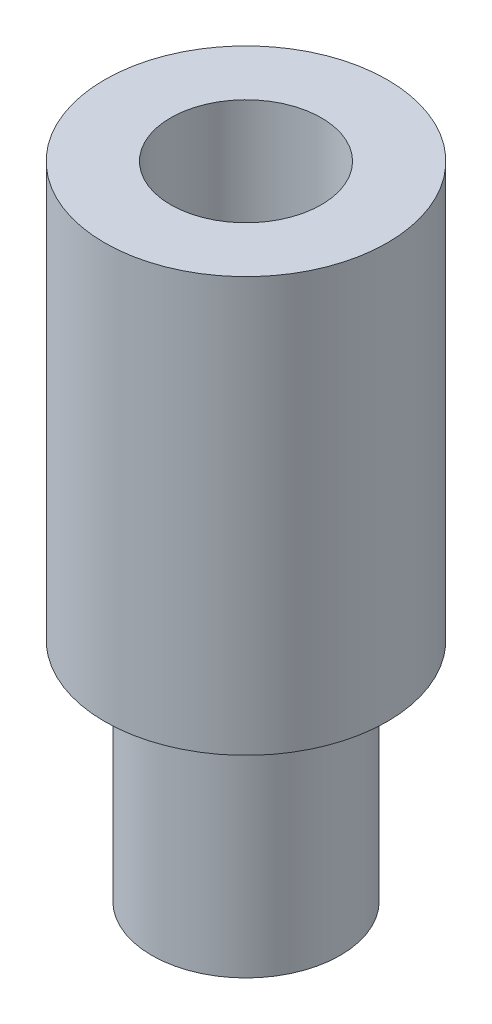
ISO-10303-21;
HEADER;
FILE_DESCRIPTION(('STEP AP214'),'2;1');
FILE_NAME('part.step','',(''),(''),'','','');
FILE_SCHEMA(('AUTOMOTIVE_DESIGN { 1 0 10303 214 1 1 1 1 }'));
ENDSEC;
DATA;
#1=APPLICATION_CONTEXT('core data for automotive mechanical design processes');
#2=APPLICATION_PROTOCOL_DEFINITION('international standard','automotive_design',2000,#1);
#3=PRODUCT_CONTEXT('',#1,'mechanical');
#4=PRODUCT('Part','Part','',(#3));
#5=PRODUCT_RELATED_PRODUCT_CATEGORY('part','',(#4));
#6=PRODUCT_DEFINITION_FORMATION('','',#4);
#7=PRODUCT_DEFINITION_CONTEXT('part definition',#1,'design');
#8=PRODUCT_DEFINITION('design','',#6,#7);
#9=PRODUCT_DEFINITION_SHAPE('','',#8);
#10=(LENGTH_UNIT() NAMED_UNIT(*) SI_UNIT(.MILLI.,.METRE.));
#11=(NAMED_UNIT(*) PLANE_ANGLE_UNIT() SI_UNIT($,.RADIAN.));
#12=(NAMED_UNIT(*) SI_UNIT($,.STERADIAN.) SOLID_ANGLE_UNIT());
#13=UNCERTAINTY_MEASURE_WITH_UNIT(LENGTH_MEASURE(1.E-05),#10,'distance_accuracy_value','');
#14=(GEOMETRIC_REPRESENTATION_CONTEXT(3) GLOBAL_UNCERTAINTY_ASSIGNED_CONTEXT((#13)) GLOBAL_UNIT_ASSIGNED_CONTEXT((#10,
#11,#12)) REPRESENTATION_CONTEXT('',''));
#15=CARTESIAN_POINT('',(0.,0.,0.));
#16=DIRECTION('',(0.,0.,1.));
#17=DIRECTION('',(1.,0.,0.));
#18=AXIS2_PLACEMENT_3D('',#15,#16,#17);
#19=CARTESIAN_POINT('',(0.,12.,0.));
#20=DIRECTION('',(0.,1.,0.));
#21=DIRECTION('',(0.,0.,1.));
#22=AXIS2_PLACEMENT_3D('',#19,#20,#21);
#23=PLANE('',#22);
#24=CARTESIAN_POINT('',(0.,12.,0.));
#25=DIRECTION('',(0.,1.,0.));
#26=DIRECTION('',(0.,0.,1.));
#27=AXIS2_PLACEMENT_3D('',#24,#25,#26);
#28=CIRCLE('',#27,1.15);
#29=CARTESIAN_POINT('',(0.,12.,1.15));
#30=VERTEX_POINT('',#29);
#31=EDGE_CURVE('E58',#30,#30,#28,.T.);
#32=ORIENTED_EDGE('',*,*,#31,.F.);
#33=EDGE_LOOP('',(#32));
#34=FACE_BOUND('',#33,.T.);
#35=CARTESIAN_POINT('',(0.,12.,0.));
#36=DIRECTION('',(0.,1.,0.));
#37=DIRECTION('',(0.,0.,1.));
#38=AXIS2_PLACEMENT_3D('',#35,#36,#37);
#39=CIRCLE('',#38,4.);
#40=CARTESIAN_POINT('',(0.,12.,4.));
#41=VERTEX_POINT('',#40);
#42=EDGE_CURVE('E10',#41,#41,#39,.F.);
#43=ORIENTED_EDGE('',*,*,#42,.F.);
#44=EDGE_LOOP('',(#43));
#45=FACE_BOUND('',#44,.T.);
#46=ADVANCED_FACE('F39',(#34,#45),#23,.T.);
#47=CARTESIAN_POINT('',(0.,0.,0.));
#48=DIRECTION('',(0.,1.,0.));
#49=DIRECTION('',(0.,0.,1.));
#50=AXIS2_PLACEMENT_3D('',#47,#48,#49);
#51=PLANE('',#50);
#52=CARTESIAN_POINT('',(0.,0.,0.));
#53=DIRECTION('',(0.,1.,0.));
#54=DIRECTION('',(0.,0.,1.));
#55=AXIS2_PLACEMENT_3D('',#52,#53,#54);
#56=CIRCLE('',#55,5.);
#57=CARTESIAN_POINT('',(0.,0.,5.));
#58=VERTEX_POINT('',#57);
#59=EDGE_CURVE('E52',#58,#58,#56,.T.);
#60=ORIENTED_EDGE('',*,*,#59,.F.);
#61=EDGE_LOOP('',(#60));
#62=FACE_BOUND('',#61,.T.);
#63=CARTESIAN_POINT('',(0.,0.,0.));
#64=DIRECTION('',(0.,1.,0.));
#65=DIRECTION('',(0.,0.,1.));
#66=AXIS2_PLACEMENT_3D('',#63,#64,#65);
#67=CIRCLE('',#66,1.15);
#68=CARTESIAN_POINT('',(0.,0.,1.15));
#69=VERTEX_POINT('',#68);
#70=EDGE_CURVE('E60',#69,#69,#67,.T.);
#71=ORIENTED_EDGE('',*,*,#70,.T.);
#72=EDGE_LOOP('',(#71));
#73=FACE_BOUND('',#72,.T.);
#74=ADVANCED_FACE('F98',(#62,#73),#51,.F.);
#75=CARTESIAN_POINT('',(0.,12.,0.));
#76=DIRECTION('',(0.,-1.,0.));
#77=DIRECTION('',(0.,0.,-1.));
#78=AXIS2_PLACEMENT_3D('',#75,#76,#77);
#79=CYLINDRICAL_SURFACE('',#78,5.);
#80=CARTESIAN_POINT('',(0.,12.,0.));
#81=DIRECTION('',(0.,1.,0.));
#82=DIRECTION('',(0.,0.,1.));
#83=AXIS2_PLACEMENT_3D('',#80,#81,#82);
#84=CIRCLE('',#83,5.);
#85=CARTESIAN_POINT('',(0.,12.,5.));
#86=VERTEX_POINT('',#85);
#87=EDGE_CURVE('E47',#86,#86,#84,.T.);
#88=ORIENTED_EDGE('',*,*,#87,.F.);
#89=EDGE_LOOP('',(#88));
#90=FACE_BOUND('',#89,.T.);
#91=ORIENTED_EDGE('',*,*,#59,.T.);
#92=EDGE_LOOP('',(#91));
#93=FACE_BOUND('',#92,.T.);
#94=ADVANCED_FACE('F41',(#90,#93),#79,.T.);
#95=CARTESIAN_POINT('',(0.,12.,0.));
#96=DIRECTION('',(0.,-1.,0.));
#97=DIRECTION('',(0.,0.,-1.));
#98=AXIS2_PLACEMENT_3D('',#95,#96,#97);
#99=CYLINDRICAL_SURFACE('',#98,1.15);
#100=ORIENTED_EDGE('',*,*,#31,.T.);
#101=EDGE_LOOP('',(#100));
#102=FACE_BOUND('',#101,.T.);
#103=ORIENTED_EDGE('',*,*,#70,.F.);
#104=EDGE_LOOP('',(#103));
#105=FACE_BOUND('',#104,.T.);
#106=ADVANCED_FACE('F85',(#102,#105),#99,.F.);
#107=CARTESIAN_POINT('',(0.,34.,0.));
#108=DIRECTION('',(0.,1.,0.));
#109=DIRECTION('',(0.,0.,1.));
#110=AXIS2_PLACEMENT_3D('',#107,#108,#109);
#111=PLANE('',#110);
#112=CARTESIAN_POINT('',(0.,34.,0.));
#113=DIRECTION('',(0.,1.,0.));
#114=DIRECTION('',(0.,0.,1.));
#115=AXIS2_PLACEMENT_3D('',#112,#113,#114);
#116=CIRCLE('',#115,7.5);
#117=CARTESIAN_POINT('',(0.,34.,7.5));
#118=VERTEX_POINT('',#117);
#119=EDGE_CURVE('E64',#118,#118,#116,.T.);
#120=ORIENTED_EDGE('',*,*,#119,.T.);
#121=EDGE_LOOP('',(#120));
#122=FACE_BOUND('',#121,.T.);
#123=CARTESIAN_POINT('',(0.,34.,0.));
#124=DIRECTION('',(0.,1.,0.));
#125=DIRECTION('',(0.,0.,1.));
#126=AXIS2_PLACEMENT_3D('',#123,#124,#125);
#127=CIRCLE('',#126,4.);
#128=CARTESIAN_POINT('',(0.,34.,4.));
#129=VERTEX_POINT('',#128);
#130=EDGE_CURVE('E72',#129,#129,#127,.T.);
#131=ORIENTED_EDGE('',*,*,#130,.F.);
#132=EDGE_LOOP('',(#131));
#133=FACE_BOUND('',#132,.T.);
#134=ADVANCED_FACE('F82',(#122,#133),#111,.T.);
#135=CARTESIAN_POINT('',(0.,12.,0.));
#136=DIRECTION('',(0.,1.,0.));
#137=DIRECTION('',(0.,0.,1.));
#138=AXIS2_PLACEMENT_3D('',#135,#136,#137);
#139=PLANE('',#138);
#140=ORIENTED_EDGE('',*,*,#87,.T.);
#141=EDGE_LOOP('',(#140));
#142=FACE_BOUND('',#141,.T.);
#143=CARTESIAN_POINT('',(0.,12.,0.));
#144=DIRECTION('',(0.,1.,0.));
#145=DIRECTION('',(0.,0.,1.));
#146=AXIS2_PLACEMENT_3D('',#143,#144,#145);
#147=CIRCLE('',#146,7.5);
#148=CARTESIAN_POINT('',(0.,12.,7.5));
#149=VERTEX_POINT('',#148);
#150=EDGE_CURVE('E68',#149,#149,#147,.T.);
#151=ORIENTED_EDGE('',*,*,#150,.F.);
#152=EDGE_LOOP('',(#151));
#153=FACE_BOUND('',#152,.T.);
#154=ADVANCED_FACE('F84',(#142,#153),#139,.F.);
#155=CARTESIAN_POINT('',(0.,34.,0.));
#156=DIRECTION('',(0.,-1.,0.));
#157=DIRECTION('',(0.,0.,-1.));
#158=AXIS2_PLACEMENT_3D('',#155,#156,#157);
#159=CYLINDRICAL_SURFACE('',#158,7.5);
#160=ORIENTED_EDGE('',*,*,#119,.F.);
#161=EDGE_LOOP('',(#160));
#162=FACE_BOUND('',#161,.T.);
#163=ORIENTED_EDGE('',*,*,#150,.T.);
#164=EDGE_LOOP('',(#163));
#165=FACE_BOUND('',#164,.T.);
#166=ADVANCED_FACE('F92',(#162,#165),#159,.T.);
#167=CARTESIAN_POINT('',(0.,34.,0.));
#168=DIRECTION('',(0.,-1.,0.));
#169=DIRECTION('',(0.,0.,-1.));
#170=AXIS2_PLACEMENT_3D('',#167,#168,#169);
#171=CYLINDRICAL_SURFACE('',#170,4.);
#172=ORIENTED_EDGE('',*,*,#130,.T.);
#173=EDGE_LOOP('',(#172));
#174=FACE_BOUND('',#173,.T.);
#175=ORIENTED_EDGE('',*,*,#42,.T.);
#176=EDGE_LOOP('',(#175));
#177=FACE_BOUND('',#176,.T.);
#178=ADVANCED_FACE('F80',(#174,#177),#171,.F.);
#179=CLOSED_SHELL('',(#46,#74,#94,#106,#134,#154,#166,#178));
#180=MANIFOLD_SOLID_BREP('B2',#179);
#181=ADVANCED_BREP_SHAPE_REPRESENTATION('',(#18,#180),#14);
#182=SHAPE_DEFINITION_REPRESENTATION(#9,#181);
ENDSEC;
END-ISO-10303-21;
